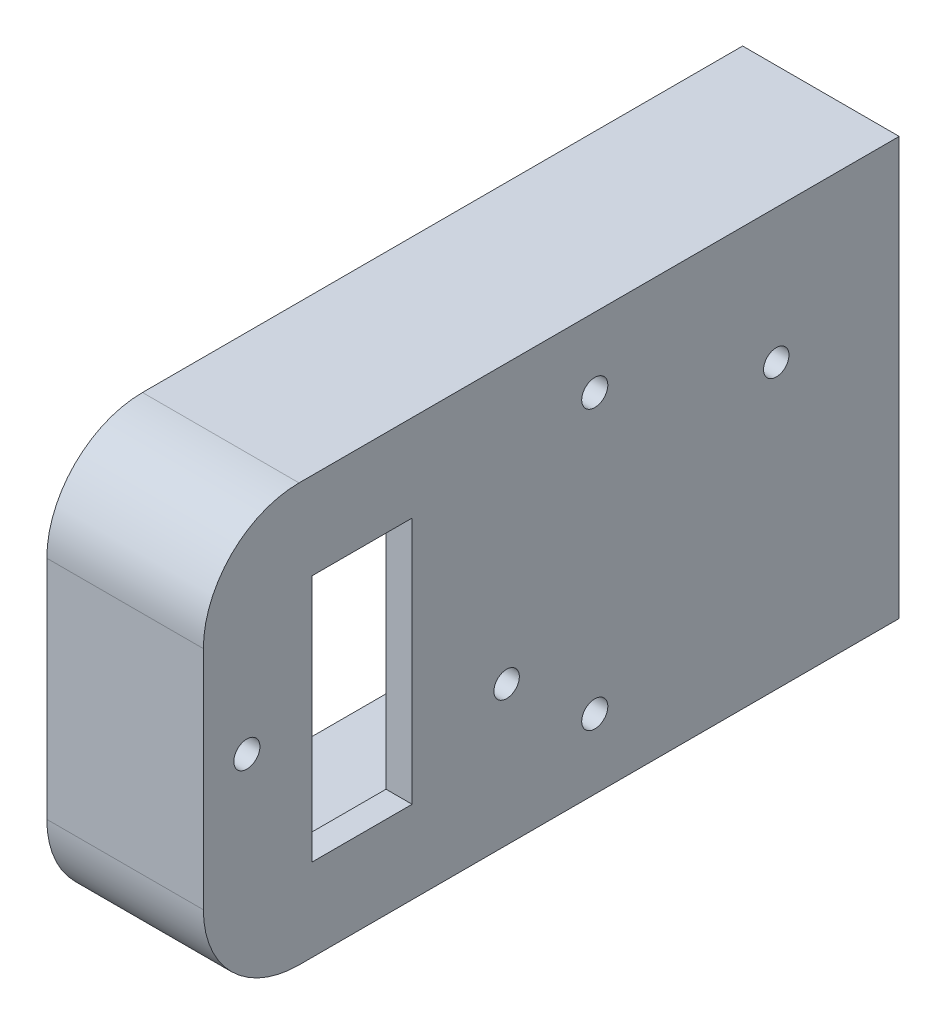
ISO-10303-21;
HEADER;
FILE_DESCRIPTION(('STEP AP214'),'2;1');
FILE_NAME('part.step','',(''),(''),'','','');
FILE_SCHEMA(('AUTOMOTIVE_DESIGN { 1 0 10303 214 1 1 1 1 }'));
ENDSEC;
DATA;
#1=APPLICATION_CONTEXT('core data for automotive mechanical design processes');
#2=APPLICATION_PROTOCOL_DEFINITION('international standard','automotive_design',2000,#1);
#3=PRODUCT_CONTEXT('',#1,'mechanical');
#4=PRODUCT('Part','Part','',(#3));
#5=PRODUCT_RELATED_PRODUCT_CATEGORY('part','',(#4));
#6=PRODUCT_DEFINITION_FORMATION('','',#4);
#7=PRODUCT_DEFINITION_CONTEXT('part definition',#1,'design');
#8=PRODUCT_DEFINITION('design','',#6,#7);
#9=PRODUCT_DEFINITION_SHAPE('','',#8);
#10=(LENGTH_UNIT() NAMED_UNIT(*) SI_UNIT(.MILLI.,.METRE.));
#11=(NAMED_UNIT(*) PLANE_ANGLE_UNIT() SI_UNIT($,.RADIAN.));
#12=(NAMED_UNIT(*) SI_UNIT($,.STERADIAN.) SOLID_ANGLE_UNIT());
#13=UNCERTAINTY_MEASURE_WITH_UNIT(LENGTH_MEASURE(1.E-05),#10,'distance_accuracy_value','');
#14=(GEOMETRIC_REPRESENTATION_CONTEXT(3) GLOBAL_UNCERTAINTY_ASSIGNED_CONTEXT((#13)) GLOBAL_UNIT_ASSIGNED_CONTEXT((#10,
#11,#12)) REPRESENTATION_CONTEXT('',''));
#15=CARTESIAN_POINT('',(0.,0.,0.));
#16=DIRECTION('',(0.,0.,1.));
#17=DIRECTION('',(1.,0.,0.));
#18=AXIS2_PLACEMENT_3D('',#15,#16,#17);
#19=CARTESIAN_POINT('',(3.,-13.,29.));
#20=DIRECTION('',(1.,0.,0.));
#21=DIRECTION('',(0.,0.,-1.));
#22=AXIS2_PLACEMENT_3D('',#19,#20,#21);
#23=PLANE('',#22);
#24=CARTESIAN_POINT('',(3.,-7.94894221700003,5.13392943292699));
#25=DIRECTION('',(-1.,0.,0.));
#26=DIRECTION('',(0.,0.,1.));
#27=AXIS2_PLACEMENT_3D('',#24,#25,#26);
#28=CIRCLE('',#27,1.4605);
#29=CARTESIAN_POINT('',(3.,-7.94894221700003,6.59442943292699));
#30=VERTEX_POINT('',#29);
#31=EDGE_CURVE('E192',#30,#30,#28,.T.);
#32=ORIENTED_EDGE('',*,*,#31,.T.);
#33=EDGE_LOOP('',(#32));
#34=FACE_BOUND('',#33,.T.);
#35=CARTESIAN_POINT('',(3.,8.57379999999998,-25.8659));
#36=DIRECTION('',(-1.,0.,0.));
#37=DIRECTION('',(0.,0.,1.));
#38=AXIS2_PLACEMENT_3D('',#35,#36,#37);
#39=CIRCLE('',#38,1.4605);
#40=CARTESIAN_POINT('',(3.,8.57379999999998,-24.4054));
#41=VERTEX_POINT('',#40);
#42=EDGE_CURVE('E193',#41,#41,#39,.T.);
#43=ORIENTED_EDGE('',*,*,#42,.T.);
#44=EDGE_LOOP('',(#43));
#45=FACE_BOUND('',#44,.T.);
#46=CARTESIAN_POINT('',(3.,0.,35.));
#47=DIRECTION('',(1.,0.,0.));
#48=DIRECTION('',(0.,0.,-1.));
#49=AXIS2_PLACEMENT_3D('',#46,#47,#48);
#50=CIRCLE('',#49,1.49999999999998);
#51=CARTESIAN_POINT('',(3.,0.,33.5));
#52=VERTEX_POINT('',#51);
#53=EDGE_CURVE('E210',#52,#52,#50,.T.);
#54=ORIENTED_EDGE('',*,*,#53,.F.);
#55=EDGE_LOOP('',(#54));
#56=FACE_BOUND('',#55,.T.);
#57=CARTESIAN_POINT('',(3.,16.,-5.00000000000001));
#58=DIRECTION('',(1.,0.,0.));
#59=DIRECTION('',(0.,0.,-1.));
#60=AXIS2_PLACEMENT_3D('',#57,#58,#59);
#61=CIRCLE('',#60,1.5);
#62=CARTESIAN_POINT('',(3.,16.,-6.50000000000001));
#63=VERTEX_POINT('',#62);
#64=EDGE_CURVE('E211',#63,#63,#61,.T.);
#65=ORIENTED_EDGE('',*,*,#64,.F.);
#66=EDGE_LOOP('',(#65));
#67=FACE_BOUND('',#66,.T.);
#68=CARTESIAN_POINT('',(3.,-16.,-5.));
#69=DIRECTION('',(1.,0.,0.));
#70=DIRECTION('',(0.,0.,-1.));
#71=AXIS2_PLACEMENT_3D('',#68,#69,#70);
#72=CIRCLE('',#71,1.5);
#73=CARTESIAN_POINT('',(3.,-16.,-6.50000000000001));
#74=VERTEX_POINT('',#73);
#75=EDGE_CURVE('E196',#74,#74,#72,.T.);
#76=ORIENTED_EDGE('',*,*,#75,.F.);
#77=EDGE_LOOP('',(#76));
#78=FACE_BOUND('',#77,.T.);
#79=DIRECTION('',(0.,0.,1.));
#80=VECTOR('',#79,1.);
#81=CARTESIAN_POINT('',(3.,24.,28.9999999999999));
#82=LINE('',#81,#80);
#83=CARTESIAN_POINT('',(3.,24.,-40.));
#84=VERTEX_POINT('',#83);
#85=CARTESIAN_POINT('',(3.,24.,28.9999999999999));
#86=VERTEX_POINT('',#85);
#87=EDGE_CURVE('E279',#84,#86,#82,.T.);
#88=ORIENTED_EDGE('',*,*,#87,.T.);
#89=CARTESIAN_POINT('',(3.,13.,29.));
#90=DIRECTION('',(1.,0.,0.));
#91=DIRECTION('',(0.,0.,1.));
#92=AXIS2_PLACEMENT_3D('',#89,#90,#91);
#93=CIRCLE('',#92,11.);
#94=CARTESIAN_POINT('',(3.,12.9999999999999,40.));
#95=VERTEX_POINT('',#94);
#96=EDGE_CURVE('E283',#86,#95,#93,.T.);
#97=ORIENTED_EDGE('',*,*,#96,.T.);
#98=DIRECTION('',(0.,-1.,0.));
#99=VECTOR('',#98,1.);
#100=CARTESIAN_POINT('',(3.,-12.9999999999999,40.));
#101=LINE('',#100,#99);
#102=CARTESIAN_POINT('',(3.,-12.9999999999999,40.));
#103=VERTEX_POINT('',#102);
#104=EDGE_CURVE('E281',#95,#103,#101,.T.);
#105=ORIENTED_EDGE('',*,*,#104,.T.);
#106=CARTESIAN_POINT('',(3.,-13.,29.));
#107=DIRECTION('',(1.,0.,0.));
#108=DIRECTION('',(0.,0.,-1.));
#109=AXIS2_PLACEMENT_3D('',#106,#107,#108);
#110=CIRCLE('',#109,11.);
#111=CARTESIAN_POINT('',(3.,-24.,28.9999999999999));
#112=VERTEX_POINT('',#111);
#113=EDGE_CURVE('E282',#103,#112,#110,.T.);
#114=ORIENTED_EDGE('',*,*,#113,.T.);
#115=DIRECTION('',(0.,0.,-1.));
#116=VECTOR('',#115,1.);
#117=CARTESIAN_POINT('',(3.,-24.,28.9999999999999));
#118=LINE('',#117,#116);
#119=CARTESIAN_POINT('',(3.,-24.,-40.));
#120=VERTEX_POINT('',#119);
#121=EDGE_CURVE('E290',#112,#120,#118,.T.);
#122=ORIENTED_EDGE('',*,*,#121,.T.);
#123=DIRECTION('',(0.,1.,0.));
#124=VECTOR('',#123,1.);
#125=CARTESIAN_POINT('',(3.,-24.,-40.));
#126=LINE('',#125,#124);
#127=EDGE_CURVE('E289',#120,#84,#126,.T.);
#128=ORIENTED_EDGE('',*,*,#127,.T.);
#129=EDGE_LOOP('',(#88,#97,#105,#114,#122,#128));
#130=FACE_BOUND('',#129,.T.);
#131=DIRECTION('',(0.,0.,1.));
#132=VECTOR('',#131,1.);
#133=CARTESIAN_POINT('',(3.,14.,0.));
#134=LINE('',#133,#132);
#135=CARTESIAN_POINT('',(3.,14.,16.));
#136=VERTEX_POINT('',#135);
#137=CARTESIAN_POINT('',(3.,14.,27.5));
#138=VERTEX_POINT('',#137);
#139=EDGE_CURVE('E169',#136,#138,#134,.T.);
#140=ORIENTED_EDGE('',*,*,#139,.F.);
#141=DIRECTION('',(0.,1.,0.));
#142=VECTOR('',#141,1.);
#143=CARTESIAN_POINT('',(3.,0.,16.));
#144=LINE('',#143,#142);
#145=CARTESIAN_POINT('',(3.,-14.5,16.));
#146=VERTEX_POINT('',#145);
#147=EDGE_CURVE('E165',#146,#136,#144,.T.);
#148=ORIENTED_EDGE('',*,*,#147,.F.);
#149=DIRECTION('',(0.,0.,1.));
#150=VECTOR('',#149,1.);
#151=CARTESIAN_POINT('',(3.,-14.5,0.));
#152=LINE('',#151,#150);
#153=CARTESIAN_POINT('',(3.,-14.5,27.5));
#154=VERTEX_POINT('',#153);
#155=EDGE_CURVE('E173',#146,#154,#152,.T.);
#156=ORIENTED_EDGE('',*,*,#155,.T.);
#157=DIRECTION('',(0.,1.,0.));
#158=VECTOR('',#157,1.);
#159=CARTESIAN_POINT('',(3.,0.,27.5));
#160=LINE('',#159,#158);
#161=EDGE_CURVE('E65',#154,#138,#160,.T.);
#162=ORIENTED_EDGE('',*,*,#161,.T.);
#163=EDGE_LOOP('',(#140,#148,#156,#162));
#164=FACE_BOUND('',#163,.T.);
#165=ADVANCED_FACE('F44',(#34,#45,#56,#67,#78,#130,#164),#23,.T.);
#166=CARTESIAN_POINT('',(0.,-13.,29.));
#167=DIRECTION('',(1.,0.,0.));
#168=DIRECTION('',(0.,0.,-1.));
#169=AXIS2_PLACEMENT_3D('',#166,#167,#168);
#170=PLANE('',#169);
#171=CARTESIAN_POINT('',(0.,9.,26.));
#172=DIRECTION('',(-1.,0.,0.));
#173=DIRECTION('',(0.,0.,-1.));
#174=AXIS2_PLACEMENT_3D('',#171,#172,#173);
#175=CIRCLE('',#174,11.);
#176=CARTESIAN_POINT('',(0.,9.,37.));
#177=VERTEX_POINT('',#176);
#178=CARTESIAN_POINT('',(0.,20.,26.));
#179=VERTEX_POINT('',#178);
#180=EDGE_CURVE('E218',#177,#179,#175,.T.);
#181=ORIENTED_EDGE('',*,*,#180,.T.);
#182=DIRECTION('',(0.,0.,-1.));
#183=VECTOR('',#182,1.);
#184=CARTESIAN_POINT('',(0.,20.,-37.));
#185=LINE('',#184,#183);
#186=CARTESIAN_POINT('',(0.,20.,-37.));
#187=VERTEX_POINT('',#186);
#188=EDGE_CURVE('E233',#179,#187,#185,.T.);
#189=ORIENTED_EDGE('',*,*,#188,.T.);
#190=DIRECTION('',(0.,-1.,0.));
#191=VECTOR('',#190,1.);
#192=CARTESIAN_POINT('',(0.,20.,-37.));
#193=LINE('',#192,#191);
#194=CARTESIAN_POINT('',(0.,-20.,-37.));
#195=VERTEX_POINT('',#194);
#196=EDGE_CURVE('E234',#187,#195,#193,.T.);
#197=ORIENTED_EDGE('',*,*,#196,.T.);
#198=DIRECTION('',(0.,0.,1.));
#199=VECTOR('',#198,1.);
#200=CARTESIAN_POINT('',(0.,-20.,-37.));
#201=LINE('',#200,#199);
#202=CARTESIAN_POINT('',(0.,-20.,26.));
#203=VERTEX_POINT('',#202);
#204=EDGE_CURVE('E240',#195,#203,#201,.T.);
#205=ORIENTED_EDGE('',*,*,#204,.T.);
#206=CARTESIAN_POINT('',(0.,-8.99999999999999,26.));
#207=DIRECTION('',(-1.,0.,0.));
#208=DIRECTION('',(0.,0.,-1.));
#209=AXIS2_PLACEMENT_3D('',#206,#207,#208);
#210=CIRCLE('',#209,11.);
#211=CARTESIAN_POINT('',(0.,-8.99999999999999,37.));
#212=VERTEX_POINT('',#211);
#213=EDGE_CURVE('E238',#203,#212,#210,.T.);
#214=ORIENTED_EDGE('',*,*,#213,.T.);
#215=DIRECTION('',(0.,1.,0.));
#216=VECTOR('',#215,1.);
#217=CARTESIAN_POINT('',(0.,9.,37.));
#218=LINE('',#217,#216);
#219=EDGE_CURVE('E241',#212,#177,#218,.T.);
#220=ORIENTED_EDGE('',*,*,#219,.T.);
#221=EDGE_LOOP('',(#181,#189,#197,#205,#214,#220));
#222=FACE_BOUND('',#221,.T.);
#223=CARTESIAN_POINT('',(0.,-16.,-5.));
#224=DIRECTION('',(1.,0.,0.));
#225=DIRECTION('',(0.,0.,-1.));
#226=AXIS2_PLACEMENT_3D('',#223,#224,#225);
#227=CIRCLE('',#226,1.5);
#228=CARTESIAN_POINT('',(0.,-16.,-6.50000000000001));
#229=VERTEX_POINT('',#228);
#230=EDGE_CURVE('E209',#229,#229,#227,.T.);
#231=ORIENTED_EDGE('',*,*,#230,.T.);
#232=EDGE_LOOP('',(#231));
#233=FACE_BOUND('',#232,.T.);
#234=CARTESIAN_POINT('',(0.,16.,-5.00000000000001));
#235=DIRECTION('',(1.,0.,0.));
#236=DIRECTION('',(0.,0.,-1.));
#237=AXIS2_PLACEMENT_3D('',#234,#235,#236);
#238=CIRCLE('',#237,1.5);
#239=CARTESIAN_POINT('',(0.,16.,-6.50000000000001));
#240=VERTEX_POINT('',#239);
#241=EDGE_CURVE('E303',#240,#240,#238,.T.);
#242=ORIENTED_EDGE('',*,*,#241,.T.);
#243=EDGE_LOOP('',(#242));
#244=FACE_BOUND('',#243,.T.);
#245=CARTESIAN_POINT('',(0.,0.,35.));
#246=DIRECTION('',(1.,0.,0.));
#247=DIRECTION('',(0.,0.,-1.));
#248=AXIS2_PLACEMENT_3D('',#245,#246,#247);
#249=CIRCLE('',#248,1.49999999999998);
#250=CARTESIAN_POINT('',(0.,0.,33.5));
#251=VERTEX_POINT('',#250);
#252=EDGE_CURVE('E47',#251,#251,#249,.T.);
#253=ORIENTED_EDGE('',*,*,#252,.T.);
#254=EDGE_LOOP('',(#253));
#255=FACE_BOUND('',#254,.T.);
#256=CARTESIAN_POINT('',(0.,8.57379999999998,-25.8659));
#257=DIRECTION('',(-1.,0.,0.));
#258=DIRECTION('',(0.,0.,1.));
#259=AXIS2_PLACEMENT_3D('',#256,#257,#258);
#260=CIRCLE('',#259,1.4605);
#261=CARTESIAN_POINT('',(0.,8.57379999999998,-24.4054));
#262=VERTEX_POINT('',#261);
#263=EDGE_CURVE('E205',#262,#262,#260,.T.);
#264=ORIENTED_EDGE('',*,*,#263,.F.);
#265=EDGE_LOOP('',(#264));
#266=FACE_BOUND('',#265,.T.);
#267=CARTESIAN_POINT('',(0.,-7.94894221700003,5.13392943292699));
#268=DIRECTION('',(-1.,0.,0.));
#269=DIRECTION('',(0.,0.,1.));
#270=AXIS2_PLACEMENT_3D('',#267,#268,#269);
#271=CIRCLE('',#270,1.4605);
#272=CARTESIAN_POINT('',(0.,-7.94894221700003,6.59442943292699));
#273=VERTEX_POINT('',#272);
#274=EDGE_CURVE('E200',#273,#273,#271,.T.);
#275=ORIENTED_EDGE('',*,*,#274,.F.);
#276=EDGE_LOOP('',(#275));
#277=FACE_BOUND('',#276,.T.);
#278=DIRECTION('',(0.,1.,0.));
#279=VECTOR('',#278,1.);
#280=CARTESIAN_POINT('',(0.,0.,16.));
#281=LINE('',#280,#279);
#282=CARTESIAN_POINT('',(0.,-14.5,16.));
#283=VERTEX_POINT('',#282);
#284=CARTESIAN_POINT('',(0.,14.,16.));
#285=VERTEX_POINT('',#284);
#286=EDGE_CURVE('E67',#283,#285,#281,.T.);
#287=ORIENTED_EDGE('',*,*,#286,.T.);
#288=DIRECTION('',(0.,0.,1.));
#289=VECTOR('',#288,1.);
#290=CARTESIAN_POINT('',(0.,14.,0.));
#291=LINE('',#290,#289);
#292=CARTESIAN_POINT('',(0.,14.,27.5));
#293=VERTEX_POINT('',#292);
#294=EDGE_CURVE('E178',#285,#293,#291,.T.);
#295=ORIENTED_EDGE('',*,*,#294,.T.);
#296=DIRECTION('',(0.,1.,0.));
#297=VECTOR('',#296,1.);
#298=CARTESIAN_POINT('',(0.,0.,27.5));
#299=LINE('',#298,#297);
#300=CARTESIAN_POINT('',(0.,-14.5,27.5));
#301=VERTEX_POINT('',#300);
#302=EDGE_CURVE('E179',#301,#293,#299,.T.);
#303=ORIENTED_EDGE('',*,*,#302,.F.);
#304=DIRECTION('',(0.,0.,1.));
#305=VECTOR('',#304,1.);
#306=CARTESIAN_POINT('',(0.,-14.5,0.));
#307=LINE('',#306,#305);
#308=EDGE_CURVE('E183',#283,#301,#307,.T.);
#309=ORIENTED_EDGE('',*,*,#308,.F.);
#310=EDGE_LOOP('',(#287,#295,#303,#309));
#311=FACE_BOUND('',#310,.T.);
#312=ADVANCED_FACE('F306',(#222,#233,#244,#255,#266,#277,#311),#170,.F.);
#313=CARTESIAN_POINT('',(3.,24.,28.9999999999999));
#314=DIRECTION('',(0.,-1.,0.));
#315=DIRECTION('',(0.,0.,-1.));
#316=AXIS2_PLACEMENT_3D('',#313,#314,#315);
#317=PLANE('',#316);
#318=DIRECTION('',(-1.,0.,0.));
#319=VECTOR('',#318,1.);
#320=CARTESIAN_POINT('',(3.,24.,-40.));
#321=LINE('',#320,#319);
#322=CARTESIAN_POINT('',(-15.,24.,-40.));
#323=VERTEX_POINT('',#322);
#324=EDGE_CURVE('E292',#84,#323,#321,.T.);
#325=ORIENTED_EDGE('',*,*,#324,.T.);
#326=DIRECTION('',(0.,0.,-1.));
#327=VECTOR('',#326,1.);
#328=CARTESIAN_POINT('',(-15.,24.,29.));
#329=LINE('',#328,#327);
#330=CARTESIAN_POINT('',(-15.,24.,29.));
#331=VERTEX_POINT('',#330);
#332=EDGE_CURVE('E275',#331,#323,#329,.T.);
#333=ORIENTED_EDGE('',*,*,#332,.F.);
#334=DIRECTION('',(-1.,0.,0.));
#335=VECTOR('',#334,1.);
#336=CARTESIAN_POINT('',(3.,24.,28.9999999999999));
#337=LINE('',#336,#335);
#338=EDGE_CURVE('E11',#86,#331,#337,.T.);
#339=ORIENTED_EDGE('',*,*,#338,.F.);
#340=ORIENTED_EDGE('',*,*,#87,.F.);
#341=EDGE_LOOP('',(#325,#333,#339,#340));
#342=FACE_BOUND('',#341,.T.);
#343=ADVANCED_FACE('F50',(#342),#317,.F.);
#344=CARTESIAN_POINT('',(3.,13.,29.));
#345=DIRECTION('',(-1.,0.,0.));
#346=DIRECTION('',(0.,0.,1.));
#347=AXIS2_PLACEMENT_3D('',#344,#345,#346);
#348=CYLINDRICAL_SURFACE('',#347,11.);
#349=ORIENTED_EDGE('',*,*,#338,.T.);
#350=CARTESIAN_POINT('',(-15.,13.,29.));
#351=DIRECTION('',(-1.,0.,0.));
#352=DIRECTION('',(0.,0.,1.));
#353=AXIS2_PLACEMENT_3D('',#350,#351,#352);
#354=CIRCLE('',#353,11.);
#355=CARTESIAN_POINT('',(-15.,13.,40.));
#356=VERTEX_POINT('',#355);
#357=EDGE_CURVE('E267',#356,#331,#354,.T.);
#358=ORIENTED_EDGE('',*,*,#357,.F.);
#359=DIRECTION('',(-1.,0.,0.));
#360=VECTOR('',#359,1.);
#361=CARTESIAN_POINT('',(3.,12.9999999999999,40.));
#362=LINE('',#361,#360);
#363=EDGE_CURVE('E53',#95,#356,#362,.T.);
#364=ORIENTED_EDGE('',*,*,#363,.F.);
#365=ORIENTED_EDGE('',*,*,#96,.F.);
#366=EDGE_LOOP('',(#349,#358,#364,#365));
#367=FACE_BOUND('',#366,.T.);
#368=ADVANCED_FACE('F352',(#367),#348,.T.);
#369=CARTESIAN_POINT('',(3.,-12.9999999999999,40.));
#370=DIRECTION('',(0.,0.,-1.));
#371=DIRECTION('',(-1.,0.,0.));
#372=AXIS2_PLACEMENT_3D('',#369,#370,#371);
#373=PLANE('',#372);
#374=ORIENTED_EDGE('',*,*,#363,.T.);
#375=DIRECTION('',(0.,1.,0.));
#376=VECTOR('',#375,1.);
#377=CARTESIAN_POINT('',(-15.,13.,40.));
#378=LINE('',#377,#376);
#379=CARTESIAN_POINT('',(-15.,-12.9999999999999,40.));
#380=VERTEX_POINT('',#379);
#381=EDGE_CURVE('E266',#380,#356,#378,.T.);
#382=ORIENTED_EDGE('',*,*,#381,.F.);
#383=DIRECTION('',(-1.,0.,0.));
#384=VECTOR('',#383,1.);
#385=CARTESIAN_POINT('',(3.,-12.9999999999999,40.));
#386=LINE('',#385,#384);
#387=EDGE_CURVE('E300',#103,#380,#386,.T.);
#388=ORIENTED_EDGE('',*,*,#387,.F.);
#389=ORIENTED_EDGE('',*,*,#104,.F.);
#390=EDGE_LOOP('',(#374,#382,#388,#389));
#391=FACE_BOUND('',#390,.T.);
#392=ADVANCED_FACE('F355',(#391),#373,.F.);
#393=CARTESIAN_POINT('',(3.,-13.,29.));
#394=DIRECTION('',(-1.,0.,0.));
#395=DIRECTION('',(0.,0.,1.));
#396=AXIS2_PLACEMENT_3D('',#393,#394,#395);
#397=CYLINDRICAL_SURFACE('',#396,11.);
#398=ORIENTED_EDGE('',*,*,#387,.T.);
#399=CARTESIAN_POINT('',(-15.,-13.,29.));
#400=DIRECTION('',(-1.,0.,0.));
#401=DIRECTION('',(0.,0.,-1.));
#402=AXIS2_PLACEMENT_3D('',#399,#400,#401);
#403=CIRCLE('',#402,11.);
#404=CARTESIAN_POINT('',(-15.,-24.,28.9999999999999));
#405=VERTEX_POINT('',#404);
#406=EDGE_CURVE('E263',#405,#380,#403,.T.);
#407=ORIENTED_EDGE('',*,*,#406,.F.);
#408=DIRECTION('',(-1.,0.,0.));
#409=VECTOR('',#408,1.);
#410=CARTESIAN_POINT('',(3.,-24.,28.9999999999999));
#411=LINE('',#410,#409);
#412=EDGE_CURVE('E293',#112,#405,#411,.T.);
#413=ORIENTED_EDGE('',*,*,#412,.F.);
#414=ORIENTED_EDGE('',*,*,#113,.F.);
#415=EDGE_LOOP('',(#398,#407,#413,#414));
#416=FACE_BOUND('',#415,.T.);
#417=ADVANCED_FACE('F346',(#416),#397,.T.);
#418=CARTESIAN_POINT('',(3.,-24.,28.9999999999999));
#419=DIRECTION('',(0.,1.,0.));
#420=DIRECTION('',(0.,0.,1.));
#421=AXIS2_PLACEMENT_3D('',#418,#419,#420);
#422=PLANE('',#421);
#423=ORIENTED_EDGE('',*,*,#412,.T.);
#424=DIRECTION('',(0.,0.,1.));
#425=VECTOR('',#424,1.);
#426=CARTESIAN_POINT('',(-15.,-24.,28.9999999999999));
#427=LINE('',#426,#425);
#428=CARTESIAN_POINT('',(-15.,-24.,-40.));
#429=VERTEX_POINT('',#428);
#430=EDGE_CURVE('E257',#429,#405,#427,.T.);
#431=ORIENTED_EDGE('',*,*,#430,.F.);
#432=DIRECTION('',(-1.,0.,0.));
#433=VECTOR('',#432,1.);
#434=CARTESIAN_POINT('',(3.,-24.,-40.));
#435=LINE('',#434,#433);
#436=EDGE_CURVE('E291',#120,#429,#435,.T.);
#437=ORIENTED_EDGE('',*,*,#436,.F.);
#438=ORIENTED_EDGE('',*,*,#121,.F.);
#439=EDGE_LOOP('',(#423,#431,#437,#438));
#440=FACE_BOUND('',#439,.T.);
#441=ADVANCED_FACE('F344',(#440),#422,.F.);
#442=CARTESIAN_POINT('',(3.,-24.,-40.));
#443=DIRECTION('',(0.,0.,1.));
#444=DIRECTION('',(1.,0.,0.));
#445=AXIS2_PLACEMENT_3D('',#442,#443,#444);
#446=PLANE('',#445);
#447=ORIENTED_EDGE('',*,*,#436,.T.);
#448=DIRECTION('',(0.,-1.,0.));
#449=VECTOR('',#448,1.);
#450=CARTESIAN_POINT('',(-15.,24.,-40.));
#451=LINE('',#450,#449);
#452=EDGE_CURVE('E274',#323,#429,#451,.T.);
#453=ORIENTED_EDGE('',*,*,#452,.F.);
#454=ORIENTED_EDGE('',*,*,#324,.F.);
#455=ORIENTED_EDGE('',*,*,#127,.F.);
#456=EDGE_LOOP('',(#447,#453,#454,#455));
#457=FACE_BOUND('',#456,.T.);
#458=ADVANCED_FACE('F343',(#457),#446,.F.);
#459=CARTESIAN_POINT('',(-15.,13.,29.));
#460=DIRECTION('',(-1.,0.,0.));
#461=DIRECTION('',(0.,0.,1.));
#462=AXIS2_PLACEMENT_3D('',#459,#460,#461);
#463=PLANE('',#462);
#464=ORIENTED_EDGE('',*,*,#430,.T.);
#465=ORIENTED_EDGE('',*,*,#406,.T.);
#466=ORIENTED_EDGE('',*,*,#381,.T.);
#467=ORIENTED_EDGE('',*,*,#357,.T.);
#468=ORIENTED_EDGE('',*,*,#332,.T.);
#469=ORIENTED_EDGE('',*,*,#452,.T.);
#470=EDGE_LOOP('',(#464,#465,#466,#467,#468,#469));
#471=FACE_BOUND('',#470,.T.);
#472=DIRECTION('',(0.,-1.,0.));
#473=VECTOR('',#472,1.);
#474=CARTESIAN_POINT('',(-15.,20.,-37.));
#475=LINE('',#474,#473);
#476=CARTESIAN_POINT('',(-15.,20.,-37.));
#477=VERTEX_POINT('',#476);
#478=CARTESIAN_POINT('',(-15.,-20.,-37.));
#479=VERTEX_POINT('',#478);
#480=EDGE_CURVE('E217',#477,#479,#475,.T.);
#481=ORIENTED_EDGE('',*,*,#480,.F.);
#482=DIRECTION('',(0.,0.,-1.));
#483=VECTOR('',#482,1.);
#484=CARTESIAN_POINT('',(-15.,20.,-37.));
#485=LINE('',#484,#483);
#486=CARTESIAN_POINT('',(-15.,20.,26.));
#487=VERTEX_POINT('',#486);
#488=EDGE_CURVE('E216',#487,#477,#485,.T.);
#489=ORIENTED_EDGE('',*,*,#488,.F.);
#490=CARTESIAN_POINT('',(-15.,9.,26.));
#491=DIRECTION('',(-1.,0.,0.));
#492=DIRECTION('',(0.,0.,-1.));
#493=AXIS2_PLACEMENT_3D('',#490,#491,#492);
#494=CIRCLE('',#493,11.);
#495=CARTESIAN_POINT('',(-15.,9.,37.));
#496=VERTEX_POINT('',#495);
#497=EDGE_CURVE('E226',#496,#487,#494,.T.);
#498=ORIENTED_EDGE('',*,*,#497,.F.);
#499=DIRECTION('',(0.,1.,0.));
#500=VECTOR('',#499,1.);
#501=CARTESIAN_POINT('',(-15.,9.,37.));
#502=LINE('',#501,#500);
#503=CARTESIAN_POINT('',(-15.,-8.99999999999999,37.));
#504=VERTEX_POINT('',#503);
#505=EDGE_CURVE('E223',#504,#496,#502,.T.);
#506=ORIENTED_EDGE('',*,*,#505,.F.);
#507=CARTESIAN_POINT('',(-15.,-8.99999999999999,26.));
#508=DIRECTION('',(-1.,0.,0.));
#509=DIRECTION('',(0.,0.,-1.));
#510=AXIS2_PLACEMENT_3D('',#507,#508,#509);
#511=CIRCLE('',#510,11.);
#512=CARTESIAN_POINT('',(-15.,-20.,26.));
#513=VERTEX_POINT('',#512);
#514=EDGE_CURVE('E224',#513,#504,#511,.T.);
#515=ORIENTED_EDGE('',*,*,#514,.F.);
#516=DIRECTION('',(0.,0.,1.));
#517=VECTOR('',#516,1.);
#518=CARTESIAN_POINT('',(-15.,-20.,-37.));
#519=LINE('',#518,#517);
#520=EDGE_CURVE('E222',#479,#513,#519,.T.);
#521=ORIENTED_EDGE('',*,*,#520,.F.);
#522=EDGE_LOOP('',(#481,#489,#498,#506,#515,#521));
#523=FACE_BOUND('',#522,.T.);
#524=ADVANCED_FACE('F336',(#471,#523),#463,.T.);
#525=CARTESIAN_POINT('',(-15.,20.,-37.));
#526=DIRECTION('',(0.,-1.,0.));
#527=DIRECTION('',(0.,0.,-1.));
#528=AXIS2_PLACEMENT_3D('',#525,#526,#527);
#529=PLANE('',#528);
#530=ORIENTED_EDGE('',*,*,#188,.F.);
#531=DIRECTION('',(1.,0.,0.));
#532=VECTOR('',#531,1.);
#533=CARTESIAN_POINT('',(-15.,20.,26.));
#534=LINE('',#533,#532);
#535=EDGE_CURVE('E227',#487,#179,#534,.T.);
#536=ORIENTED_EDGE('',*,*,#535,.F.);
#537=ORIENTED_EDGE('',*,*,#488,.T.);
#538=DIRECTION('',(1.,0.,0.));
#539=VECTOR('',#538,1.);
#540=CARTESIAN_POINT('',(-15.,20.,-37.));
#541=LINE('',#540,#539);
#542=EDGE_CURVE('E260',#477,#187,#541,.T.);
#543=ORIENTED_EDGE('',*,*,#542,.T.);
#544=EDGE_LOOP('',(#530,#536,#537,#543));
#545=FACE_BOUND('',#544,.T.);
#546=ADVANCED_FACE('F383',(#545),#529,.T.);
#547=CARTESIAN_POINT('',(-15.,20.,-37.));
#548=DIRECTION('',(0.,0.,1.));
#549=DIRECTION('',(1.,0.,0.));
#550=AXIS2_PLACEMENT_3D('',#547,#548,#549);
#551=PLANE('',#550);
#552=ORIENTED_EDGE('',*,*,#196,.F.);
#553=ORIENTED_EDGE('',*,*,#542,.F.);
#554=ORIENTED_EDGE('',*,*,#480,.T.);
#555=DIRECTION('',(1.,0.,0.));
#556=VECTOR('',#555,1.);
#557=CARTESIAN_POINT('',(-15.,-20.,-37.));
#558=LINE('',#557,#556);
#559=EDGE_CURVE('E254',#479,#195,#558,.T.);
#560=ORIENTED_EDGE('',*,*,#559,.T.);
#561=EDGE_LOOP('',(#552,#553,#554,#560));
#562=FACE_BOUND('',#561,.T.);
#563=ADVANCED_FACE('F391',(#562),#551,.T.);
#564=CARTESIAN_POINT('',(-15.,-20.,-37.));
#565=DIRECTION('',(0.,1.,0.));
#566=DIRECTION('',(0.,0.,1.));
#567=AXIS2_PLACEMENT_3D('',#564,#565,#566);
#568=PLANE('',#567);
#569=ORIENTED_EDGE('',*,*,#204,.F.);
#570=ORIENTED_EDGE('',*,*,#559,.F.);
#571=ORIENTED_EDGE('',*,*,#520,.T.);
#572=DIRECTION('',(1.,0.,0.));
#573=VECTOR('',#572,1.);
#574=CARTESIAN_POINT('',(-15.,-20.,26.));
#575=LINE('',#574,#573);
#576=EDGE_CURVE('E251',#513,#203,#575,.T.);
#577=ORIENTED_EDGE('',*,*,#576,.T.);
#578=EDGE_LOOP('',(#569,#570,#571,#577));
#579=FACE_BOUND('',#578,.T.);
#580=ADVANCED_FACE('F398',(#579),#568,.T.);
#581=CARTESIAN_POINT('',(-15.,-8.99999999999999,26.));
#582=DIRECTION('',(1.,0.,0.));
#583=DIRECTION('',(0.,0.,-1.));
#584=AXIS2_PLACEMENT_3D('',#581,#582,#583);
#585=CYLINDRICAL_SURFACE('',#584,11.);
#586=ORIENTED_EDGE('',*,*,#213,.F.);
#587=ORIENTED_EDGE('',*,*,#576,.F.);
#588=ORIENTED_EDGE('',*,*,#514,.T.);
#589=DIRECTION('',(1.,0.,0.));
#590=VECTOR('',#589,1.);
#591=CARTESIAN_POINT('',(-15.,-8.99999999999999,37.));
#592=LINE('',#591,#590);
#593=EDGE_CURVE('E253',#504,#212,#592,.T.);
#594=ORIENTED_EDGE('',*,*,#593,.T.);
#595=EDGE_LOOP('',(#586,#587,#588,#594));
#596=FACE_BOUND('',#595,.T.);
#597=ADVANCED_FACE('F415',(#596),#585,.F.);
#598=CARTESIAN_POINT('',(-15.,9.,37.));
#599=DIRECTION('',(0.,0.,-1.));
#600=DIRECTION('',(-1.,0.,0.));
#601=AXIS2_PLACEMENT_3D('',#598,#599,#600);
#602=PLANE('',#601);
#603=ORIENTED_EDGE('',*,*,#219,.F.);
#604=ORIENTED_EDGE('',*,*,#593,.F.);
#605=ORIENTED_EDGE('',*,*,#505,.T.);
#606=DIRECTION('',(1.,0.,0.));
#607=VECTOR('',#606,1.);
#608=CARTESIAN_POINT('',(-15.,9.,37.));
#609=LINE('',#608,#607);
#610=EDGE_CURVE('E249',#496,#177,#609,.T.);
#611=ORIENTED_EDGE('',*,*,#610,.T.);
#612=EDGE_LOOP('',(#603,#604,#605,#611));
#613=FACE_BOUND('',#612,.T.);
#614=ADVANCED_FACE('F407',(#613),#602,.T.);
#615=CARTESIAN_POINT('',(-15.,9.,26.));
#616=DIRECTION('',(1.,0.,0.));
#617=DIRECTION('',(0.,0.,-1.));
#618=AXIS2_PLACEMENT_3D('',#615,#616,#617);
#619=CYLINDRICAL_SURFACE('',#618,11.);
#620=ORIENTED_EDGE('',*,*,#180,.F.);
#621=ORIENTED_EDGE('',*,*,#610,.F.);
#622=ORIENTED_EDGE('',*,*,#497,.T.);
#623=ORIENTED_EDGE('',*,*,#535,.T.);
#624=EDGE_LOOP('',(#620,#621,#622,#623));
#625=FACE_BOUND('',#624,.T.);
#626=ADVANCED_FACE('F403',(#625),#619,.F.);
#627=CARTESIAN_POINT('',(-15.,-16.,-5.));
#628=DIRECTION('',(1.,0.,0.));
#629=DIRECTION('',(0.,0.,-1.));
#630=AXIS2_PLACEMENT_3D('',#627,#628,#629);
#631=CYLINDRICAL_SURFACE('',#630,1.5);
#632=ORIENTED_EDGE('',*,*,#75,.T.);
#633=EDGE_LOOP('',(#632));
#634=FACE_BOUND('',#633,.T.);
#635=ORIENTED_EDGE('',*,*,#230,.F.);
#636=EDGE_LOOP('',(#635));
#637=FACE_BOUND('',#636,.T.);
#638=ADVANCED_FACE('F322',(#634,#637),#631,.F.);
#639=CARTESIAN_POINT('',(-15.,16.,-5.00000000000001));
#640=DIRECTION('',(1.,0.,0.));
#641=DIRECTION('',(0.,0.,-1.));
#642=AXIS2_PLACEMENT_3D('',#639,#640,#641);
#643=CYLINDRICAL_SURFACE('',#642,1.5);
#644=ORIENTED_EDGE('',*,*,#64,.T.);
#645=EDGE_LOOP('',(#644));
#646=FACE_BOUND('',#645,.T.);
#647=ORIENTED_EDGE('',*,*,#241,.F.);
#648=EDGE_LOOP('',(#647));
#649=FACE_BOUND('',#648,.T.);
#650=ADVANCED_FACE('F314',(#646,#649),#643,.F.);
#651=CARTESIAN_POINT('',(-15.,0.,35.));
#652=DIRECTION('',(1.,0.,0.));
#653=DIRECTION('',(0.,0.,-1.));
#654=AXIS2_PLACEMENT_3D('',#651,#652,#653);
#655=CYLINDRICAL_SURFACE('',#654,1.49999999999998);
#656=ORIENTED_EDGE('',*,*,#53,.T.);
#657=EDGE_LOOP('',(#656));
#658=FACE_BOUND('',#657,.T.);
#659=ORIENTED_EDGE('',*,*,#252,.F.);
#660=EDGE_LOOP('',(#659));
#661=FACE_BOUND('',#660,.T.);
#662=ADVANCED_FACE('F313',(#658,#661),#655,.F.);
#663=CARTESIAN_POINT('',(3.,8.57379999999998,-25.8659));
#664=DIRECTION('',(-1.,0.,0.));
#665=DIRECTION('',(0.,0.,1.));
#666=AXIS2_PLACEMENT_3D('',#663,#664,#665);
#667=CYLINDRICAL_SURFACE('',#666,1.4605);
#668=ORIENTED_EDGE('',*,*,#42,.F.);
#669=EDGE_LOOP('',(#668));
#670=FACE_BOUND('',#669,.T.);
#671=ORIENTED_EDGE('',*,*,#263,.T.);
#672=EDGE_LOOP('',(#671));
#673=FACE_BOUND('',#672,.T.);
#674=ADVANCED_FACE('F311',(#670,#673),#667,.F.);
#675=CARTESIAN_POINT('',(3.,-7.94894221700003,5.13392943292699));
#676=DIRECTION('',(-1.,0.,0.));
#677=DIRECTION('',(0.,0.,1.));
#678=AXIS2_PLACEMENT_3D('',#675,#676,#677);
#679=CYLINDRICAL_SURFACE('',#678,1.4605);
#680=ORIENTED_EDGE('',*,*,#31,.F.);
#681=EDGE_LOOP('',(#680));
#682=FACE_BOUND('',#681,.T.);
#683=ORIENTED_EDGE('',*,*,#274,.T.);
#684=EDGE_LOOP('',(#683));
#685=FACE_BOUND('',#684,.T.);
#686=ADVANCED_FACE('F321',(#682,#685),#679,.F.);
#687=CARTESIAN_POINT('',(3.,0.,16.));
#688=DIRECTION('',(0.,0.,1.));
#689=DIRECTION('',(1.,0.,0.));
#690=AXIS2_PLACEMENT_3D('',#687,#688,#689);
#691=PLANE('',#690);
#692=ORIENTED_EDGE('',*,*,#286,.F.);
#693=DIRECTION('',(-1.,0.,0.));
#694=VECTOR('',#693,1.);
#695=CARTESIAN_POINT('',(3.,-14.5,16.));
#696=LINE('',#695,#694);
#697=EDGE_CURVE('E158',#146,#283,#696,.T.);
#698=ORIENTED_EDGE('',*,*,#697,.F.);
#699=ORIENTED_EDGE('',*,*,#147,.T.);
#700=DIRECTION('',(-1.,0.,0.));
#701=VECTOR('',#700,1.);
#702=CARTESIAN_POINT('',(3.,14.,16.));
#703=LINE('',#702,#701);
#704=EDGE_CURVE('E189',#136,#285,#703,.T.);
#705=ORIENTED_EDGE('',*,*,#704,.T.);
#706=EDGE_LOOP('',(#692,#698,#699,#705));
#707=FACE_BOUND('',#706,.T.);
#708=ADVANCED_FACE('F159',(#707),#691,.T.);
#709=CARTESIAN_POINT('',(3.,14.,0.));
#710=DIRECTION('',(0.,-1.,0.));
#711=DIRECTION('',(0.,0.,-1.));
#712=AXIS2_PLACEMENT_3D('',#709,#710,#711);
#713=PLANE('',#712);
#714=ORIENTED_EDGE('',*,*,#294,.F.);
#715=ORIENTED_EDGE('',*,*,#704,.F.);
#716=ORIENTED_EDGE('',*,*,#139,.T.);
#717=DIRECTION('',(-1.,0.,0.));
#718=VECTOR('',#717,1.);
#719=CARTESIAN_POINT('',(3.,14.,27.5));
#720=LINE('',#719,#718);
#721=EDGE_CURVE('E195',#138,#293,#720,.T.);
#722=ORIENTED_EDGE('',*,*,#721,.T.);
#723=EDGE_LOOP('',(#714,#715,#716,#722));
#724=FACE_BOUND('',#723,.T.);
#725=ADVANCED_FACE('F509',(#724),#713,.T.);
#726=CARTESIAN_POINT('',(3.,0.,27.5));
#727=DIRECTION('',(0.,0.,1.));
#728=DIRECTION('',(1.,0.,0.));
#729=AXIS2_PLACEMENT_3D('',#726,#727,#728);
#730=PLANE('',#729);
#731=ORIENTED_EDGE('',*,*,#302,.T.);
#732=ORIENTED_EDGE('',*,*,#721,.F.);
#733=ORIENTED_EDGE('',*,*,#161,.F.);
#734=DIRECTION('',(-1.,0.,0.));
#735=VECTOR('',#734,1.);
#736=CARTESIAN_POINT('',(3.,-14.5,27.5));
#737=LINE('',#736,#735);
#738=EDGE_CURVE('E170',#154,#301,#737,.T.);
#739=ORIENTED_EDGE('',*,*,#738,.T.);
#740=EDGE_LOOP('',(#731,#732,#733,#739));
#741=FACE_BOUND('',#740,.T.);
#742=ADVANCED_FACE('F516',(#741),#730,.F.);
#743=CARTESIAN_POINT('',(3.,-14.5,0.));
#744=DIRECTION('',(0.,-1.,0.));
#745=DIRECTION('',(0.,0.,-1.));
#746=AXIS2_PLACEMENT_3D('',#743,#744,#745);
#747=PLANE('',#746);
#748=ORIENTED_EDGE('',*,*,#308,.T.);
#749=ORIENTED_EDGE('',*,*,#738,.F.);
#750=ORIENTED_EDGE('',*,*,#155,.F.);
#751=ORIENTED_EDGE('',*,*,#697,.T.);
#752=EDGE_LOOP('',(#748,#749,#750,#751));
#753=FACE_BOUND('',#752,.T.);
#754=ADVANCED_FACE('F175',(#753),#747,.F.);
#755=CLOSED_SHELL('',(#165,#312,#343,#368,#392,#417,#441,#458,#524,#546,#563,#580,#597,#614,
#626,#638,#650,#662,#674,#686,#708,#725,#742,#754));
#756=MANIFOLD_SOLID_BREP('B2',#755);
#757=ADVANCED_BREP_SHAPE_REPRESENTATION('',(#18,#756),#14);
#758=SHAPE_DEFINITION_REPRESENTATION(#9,#757);
ENDSEC;
END-ISO-10303-21;
